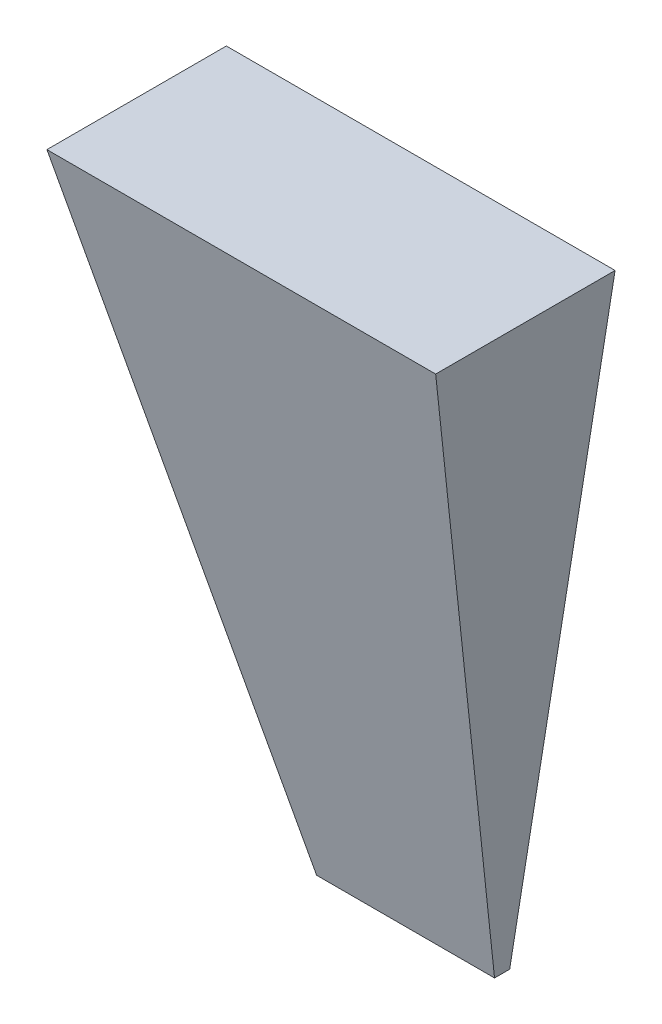
ISO-10303-21;
HEADER;
FILE_DESCRIPTION(('STEP AP214'),'2;1');
FILE_NAME('part.step','',(''),(''),'','','');
FILE_SCHEMA(('AUTOMOTIVE_DESIGN { 1 0 10303 214 1 1 1 1 }'));
ENDSEC;
DATA;
#1=APPLICATION_CONTEXT('core data for automotive mechanical design processes');
#2=APPLICATION_PROTOCOL_DEFINITION('international standard','automotive_design',2000,#1);
#3=PRODUCT_CONTEXT('',#1,'mechanical');
#4=PRODUCT('Part','Part','',(#3));
#5=PRODUCT_RELATED_PRODUCT_CATEGORY('part','',(#4));
#6=PRODUCT_DEFINITION_FORMATION('','',#4);
#7=PRODUCT_DEFINITION_CONTEXT('part definition',#1,'design');
#8=PRODUCT_DEFINITION('design','',#6,#7);
#9=PRODUCT_DEFINITION_SHAPE('','',#8);
#10=(LENGTH_UNIT() NAMED_UNIT(*) SI_UNIT(.MILLI.,.METRE.));
#11=(NAMED_UNIT(*) PLANE_ANGLE_UNIT() SI_UNIT($,.RADIAN.));
#12=(NAMED_UNIT(*) SI_UNIT($,.STERADIAN.) SOLID_ANGLE_UNIT());
#13=UNCERTAINTY_MEASURE_WITH_UNIT(LENGTH_MEASURE(1.E-05),#10,'distance_accuracy_value','');
#14=(GEOMETRIC_REPRESENTATION_CONTEXT(3) GLOBAL_UNCERTAINTY_ASSIGNED_CONTEXT((#13)) GLOBAL_UNIT_ASSIGNED_CONTEXT((#10,
#11,#12)) REPRESENTATION_CONTEXT('',''));
#15=CARTESIAN_POINT('',(0.,0.,0.));
#16=DIRECTION('',(0.,0.,1.));
#17=DIRECTION('',(1.,0.,0.));
#18=AXIS2_PLACEMENT_3D('',#15,#16,#17);
#19=CARTESIAN_POINT('',(0.,-11.,3.));
#20=DIRECTION('',(0.,1.,0.));
#21=DIRECTION('',(0.,0.,1.));
#22=AXIS2_PLACEMENT_3D('',#19,#20,#21);
#23=PLANE('',#22);
#24=DIRECTION('',(1.,0.,0.));
#25=VECTOR('',#24,1.);
#26=CARTESIAN_POINT('',(0.,-11.,0.));
#27=LINE('',#26,#25);
#28=CARTESIAN_POINT('',(1.76258844951175,-11.,0.));
#29=VERTEX_POINT('',#28);
#30=CARTESIAN_POINT('',(4.73741155048825,-11.,0.));
#31=VERTEX_POINT('',#30);
#32=EDGE_CURVE('E87',#29,#31,#27,.T.);
#33=ORIENTED_EDGE('',*,*,#32,.T.);
#34=DIRECTION('',(0.,0.,-1.));
#35=VECTOR('',#34,1.);
#36=CARTESIAN_POINT('',(4.73741155048825,-11.,10.));
#37=LINE('',#36,#35);
#38=CARTESIAN_POINT('',(4.73741155048825,-11.,0.252978195045207));
#39=VERTEX_POINT('',#38);
#40=EDGE_CURVE('E72',#39,#31,#37,.T.);
#41=ORIENTED_EDGE('',*,*,#40,.F.);
#42=DIRECTION('',(1.,0.,0.));
#43=VECTOR('',#42,1.);
#44=CARTESIAN_POINT('',(-3.5,-11.,0.252978195045207));
#45=LINE('',#44,#43);
#46=CARTESIAN_POINT('',(1.76258844951175,-11.,0.252978195045207));
#47=VERTEX_POINT('',#46);
#48=EDGE_CURVE('E80',#47,#39,#45,.T.);
#49=ORIENTED_EDGE('',*,*,#48,.F.);
#50=DIRECTION('',(0.,0.,-1.));
#51=VECTOR('',#50,1.);
#52=CARTESIAN_POINT('',(1.76258844951175,-11.,10.));
#53=LINE('',#52,#51);
#54=EDGE_CURVE('E49',#47,#29,#53,.T.);
#55=ORIENTED_EDGE('',*,*,#54,.T.);
#56=EDGE_LOOP('',(#33,#41,#49,#55));
#57=FACE_BOUND('',#56,.T.);
#58=ADVANCED_FACE('F35',(#57),#23,.F.);
#59=CARTESIAN_POINT('',(0.,0.,3.));
#60=DIRECTION('',(0.,-1.,0.));
#61=DIRECTION('',(0.,0.,-1.));
#62=AXIS2_PLACEMENT_3D('',#59,#60,#61);
#63=PLANE('',#62);
#64=DIRECTION('',(-1.,0.,0.));
#65=VECTOR('',#64,1.);
#66=CARTESIAN_POINT('',(0.,0.,0.));
#67=LINE('',#66,#65);
#68=CARTESIAN_POINT('',(6.5,0.,0.));
#69=VERTEX_POINT('',#68);
#70=CARTESIAN_POINT('',(0.,0.,0.));
#71=VERTEX_POINT('',#70);
#72=EDGE_CURVE('E89',#69,#71,#67,.T.);
#73=ORIENTED_EDGE('',*,*,#72,.T.);
#74=DIRECTION('',(0.,0.,-1.));
#75=VECTOR('',#74,1.);
#76=CARTESIAN_POINT('',(0.,0.,3.));
#77=LINE('',#76,#75);
#78=CARTESIAN_POINT('',(0.,0.,3.));
#79=VERTEX_POINT('',#78);
#80=EDGE_CURVE('E97',#79,#71,#77,.T.);
#81=ORIENTED_EDGE('',*,*,#80,.F.);
#82=DIRECTION('',(-1.,0.,0.));
#83=VECTOR('',#82,1.);
#84=CARTESIAN_POINT('',(0.,0.,3.));
#85=LINE('',#84,#83);
#86=CARTESIAN_POINT('',(6.5,0.,3.));
#87=VERTEX_POINT('',#86);
#88=EDGE_CURVE('E92',#87,#79,#85,.T.);
#89=ORIENTED_EDGE('',*,*,#88,.F.);
#90=DIRECTION('',(0.,0.,-1.));
#91=VECTOR('',#90,1.);
#92=CARTESIAN_POINT('',(6.5,0.,3.));
#93=LINE('',#92,#91);
#94=EDGE_CURVE('E57',#87,#69,#93,.T.);
#95=ORIENTED_EDGE('',*,*,#94,.T.);
#96=EDGE_LOOP('',(#73,#81,#89,#95));
#97=FACE_BOUND('',#96,.T.);
#98=ADVANCED_FACE('F108',(#97),#63,.F.);
#99=CARTESIAN_POINT('',(0.,0.,0.));
#100=DIRECTION('',(0.,0.,1.));
#101=DIRECTION('',(1.,0.,0.));
#102=AXIS2_PLACEMENT_3D('',#99,#100,#101);
#103=PLANE('',#102);
#104=ORIENTED_EDGE('',*,*,#72,.F.);
#105=DIRECTION('',(0.158217046935,0.987404357930006,0.));
#106=VECTOR('',#105,1.);
#107=CARTESIAN_POINT('',(6.5,0.,0.));
#108=LINE('',#107,#106);
#109=EDGE_CURVE('E75',#31,#69,#108,.T.);
#110=ORIENTED_EDGE('',*,*,#109,.F.);
#111=ORIENTED_EDGE('',*,*,#32,.F.);
#112=DIRECTION('',(0.158217046935,-0.987404357930006,0.));
#113=VECTOR('',#112,1.);
#114=CARTESIAN_POINT('',(0.,0.,0.));
#115=LINE('',#114,#113);
#116=EDGE_CURVE('E105',#71,#29,#115,.T.);
#117=ORIENTED_EDGE('',*,*,#116,.F.);
#118=EDGE_LOOP('',(#104,#110,#111,#117));
#119=FACE_BOUND('',#118,.T.);
#120=ADVANCED_FACE('F85',(#119),#103,.F.);
#121=CARTESIAN_POINT('',(-3.5,0.,3.));
#122=DIRECTION('',(0.,0.242288390845343,-0.970204275223303));
#123=DIRECTION('',(0.,0.970204275223303,0.242288390845343));
#124=AXIS2_PLACEMENT_3D('',#121,#122,#123);
#125=PLANE('',#124);
#126=ORIENTED_EDGE('',*,*,#48,.T.);
#127=DIRECTION('',(0.153615766594072,0.958688588367221,0.239412586946008));
#128=VECTOR('',#127,1.);
#129=CARTESIAN_POINT('',(6.26402196253716,-1.4726968242702,2.63222451924019));
#130=LINE('',#129,#128);
#131=EDGE_CURVE('E11',#39,#87,#130,.T.);
#132=ORIENTED_EDGE('',*,*,#131,.T.);
#133=ORIENTED_EDGE('',*,*,#88,.T.);
#134=DIRECTION('',(0.153615766594072,-0.958688588367221,-0.239412586946008));
#135=VECTOR('',#134,1.);
#136=CARTESIAN_POINT('',(-0.0825923131119932,0.515443888494567,3.12872141826593));
#137=LINE('',#136,#135);
#138=EDGE_CURVE('E42',#79,#47,#137,.T.);
#139=ORIENTED_EDGE('',*,*,#138,.T.);
#140=EDGE_LOOP('',(#126,#132,#133,#139));
#141=FACE_BOUND('',#140,.T.);
#142=ADVANCED_FACE('F101',(#141),#125,.F.);
#143=CARTESIAN_POINT('',(0.,0.,10.));
#144=DIRECTION('',(0.987404357930006,0.158217046935,0.));
#145=DIRECTION('',(-0.158217046935,0.987404357930006,0.));
#146=AXIS2_PLACEMENT_3D('',#143,#144,#145);
#147=PLANE('',#146);
#148=ORIENTED_EDGE('',*,*,#80,.T.);
#149=ORIENTED_EDGE('',*,*,#116,.T.);
#150=ORIENTED_EDGE('',*,*,#54,.F.);
#151=ORIENTED_EDGE('',*,*,#138,.F.);
#152=EDGE_LOOP('',(#148,#149,#150,#151));
#153=FACE_BOUND('',#152,.T.);
#154=ADVANCED_FACE('F104',(#153),#147,.F.);
#155=CARTESIAN_POINT('',(6.5,0.,10.));
#156=DIRECTION('',(-0.987404357930006,0.158217046935,0.));
#157=DIRECTION('',(-0.158217046935,-0.987404357930006,0.));
#158=AXIS2_PLACEMENT_3D('',#155,#156,#157);
#159=PLANE('',#158);
#160=ORIENTED_EDGE('',*,*,#40,.T.);
#161=ORIENTED_EDGE('',*,*,#109,.T.);
#162=ORIENTED_EDGE('',*,*,#94,.F.);
#163=ORIENTED_EDGE('',*,*,#131,.F.);
#164=EDGE_LOOP('',(#160,#161,#162,#163));
#165=FACE_BOUND('',#164,.T.);
#166=ADVANCED_FACE('F74',(#165),#159,.F.);
#167=CLOSED_SHELL('',(#58,#98,#120,#142,#154,#166));
#168=MANIFOLD_SOLID_BREP('B2',#167);
#169=ADVANCED_BREP_SHAPE_REPRESENTATION('',(#18,#168),#14);
#170=SHAPE_DEFINITION_REPRESENTATION(#9,#169);
ENDSEC;
END-ISO-10303-21;
